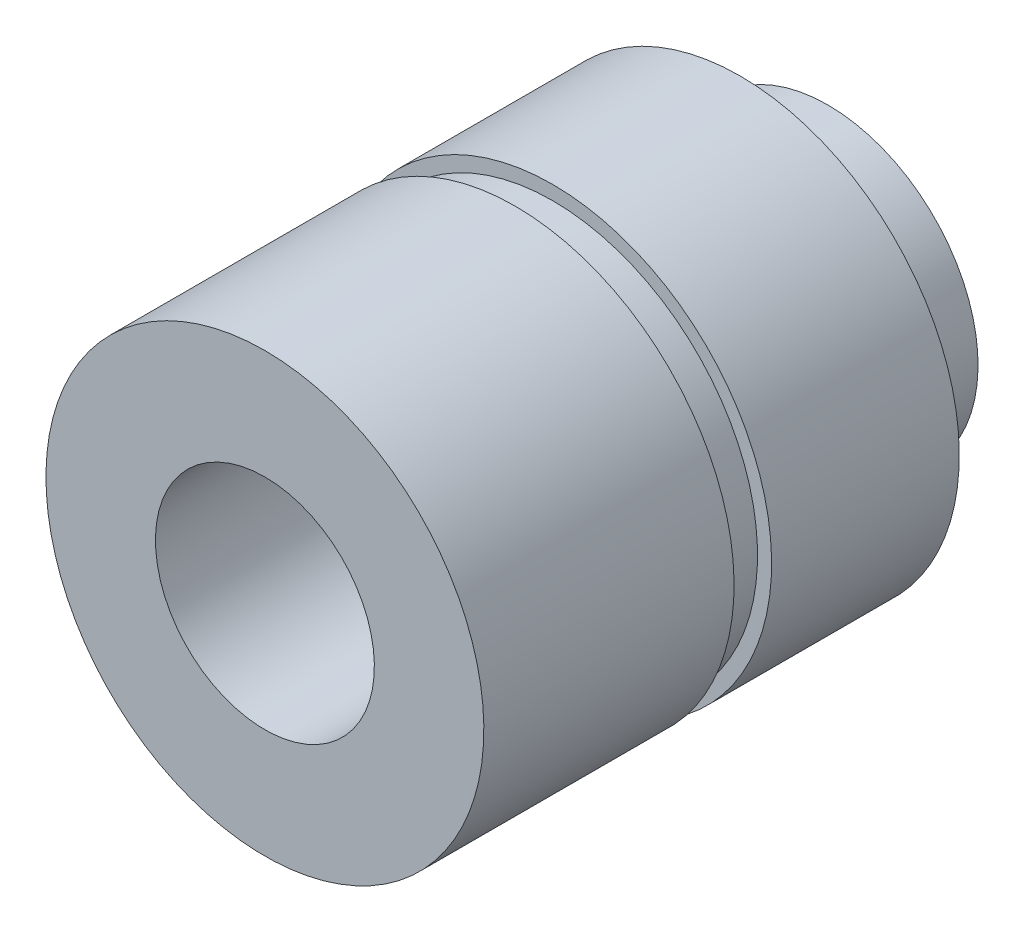
ISO-10303-21;
HEADER;
FILE_DESCRIPTION(('STEP AP214'),'2;1');
FILE_NAME('part.step','',(''),(''),'','','');
FILE_SCHEMA(('AUTOMOTIVE_DESIGN { 1 0 10303 214 1 1 1 1 }'));
ENDSEC;
DATA;
#1=APPLICATION_CONTEXT('core data for automotive mechanical design processes');
#2=APPLICATION_PROTOCOL_DEFINITION('international standard','automotive_design',2000,#1);
#3=PRODUCT_CONTEXT('',#1,'mechanical');
#4=PRODUCT('Part','Part','',(#3));
#5=PRODUCT_RELATED_PRODUCT_CATEGORY('part','',(#4));
#6=PRODUCT_DEFINITION_FORMATION('','',#4);
#7=PRODUCT_DEFINITION_CONTEXT('part definition',#1,'design');
#8=PRODUCT_DEFINITION('design','',#6,#7);
#9=PRODUCT_DEFINITION_SHAPE('','',#8);
#10=(LENGTH_UNIT() NAMED_UNIT(*) SI_UNIT(.MILLI.,.METRE.));
#11=(NAMED_UNIT(*) PLANE_ANGLE_UNIT() SI_UNIT($,.RADIAN.));
#12=(NAMED_UNIT(*) SI_UNIT($,.STERADIAN.) SOLID_ANGLE_UNIT());
#13=UNCERTAINTY_MEASURE_WITH_UNIT(LENGTH_MEASURE(1.E-05),#10,'distance_accuracy_value','');
#14=(GEOMETRIC_REPRESENTATION_CONTEXT(3) GLOBAL_UNCERTAINTY_ASSIGNED_CONTEXT((#13)) GLOBAL_UNIT_ASSIGNED_CONTEXT((#10,
#11,#12)) REPRESENTATION_CONTEXT('',''));
#15=CARTESIAN_POINT('',(0.,0.,0.));
#16=DIRECTION('',(0.,0.,1.));
#17=DIRECTION('',(1.,0.,0.));
#18=AXIS2_PLACEMENT_3D('',#15,#16,#17);
#19=CARTESIAN_POINT('',(0.,0.,-18.));
#20=DIRECTION('',(0.,0.,-1.));
#21=DIRECTION('',(0.,1.,0.));
#22=AXIS2_PLACEMENT_3D('',#19,#20,#21);
#23=CYLINDRICAL_SURFACE('',#22,3.5);
#24=CARTESIAN_POINT('',(0.,0.,-18.));
#25=DIRECTION('',(0.,0.,-1.));
#26=DIRECTION('',(0.,1.,0.));
#27=AXIS2_PLACEMENT_3D('',#24,#25,#26);
#28=CIRCLE('',#27,3.5);
#29=CARTESIAN_POINT('',(0.,3.5,-18.));
#30=VERTEX_POINT('',#29);
#31=EDGE_CURVE('E86',#30,#30,#28,.T.);
#32=ORIENTED_EDGE('',*,*,#31,.T.);
#33=EDGE_LOOP('',(#32));
#34=FACE_BOUND('',#33,.T.);
#35=CARTESIAN_POINT('',(0.,0.,0.));
#36=DIRECTION('',(0.,0.,-1.));
#37=DIRECTION('',(0.,1.,0.));
#38=AXIS2_PLACEMENT_3D('',#35,#36,#37);
#39=CIRCLE('',#38,3.5);
#40=CARTESIAN_POINT('',(0.,3.5,0.));
#41=VERTEX_POINT('',#40);
#42=EDGE_CURVE('E10',#41,#41,#39,.T.);
#43=ORIENTED_EDGE('',*,*,#42,.F.);
#44=EDGE_LOOP('',(#43));
#45=FACE_BOUND('',#44,.T.);
#46=ADVANCED_FACE('F43',(#34,#45),#23,.F.);
#47=CARTESIAN_POINT('',(0.,3.5,0.));
#48=DIRECTION('',(0.,0.,1.));
#49=DIRECTION('',(0.,-1.,0.));
#50=AXIS2_PLACEMENT_3D('',#47,#48,#49);
#51=PLANE('',#50);
#52=ORIENTED_EDGE('',*,*,#42,.T.);
#53=EDGE_LOOP('',(#52));
#54=FACE_BOUND('',#53,.T.);
#55=CARTESIAN_POINT('',(0.,0.,0.));
#56=DIRECTION('',(0.,0.,-1.));
#57=DIRECTION('',(0.,1.,0.));
#58=AXIS2_PLACEMENT_3D('',#55,#56,#57);
#59=CIRCLE('',#58,7.);
#60=CARTESIAN_POINT('',(0.,7.,0.));
#61=VERTEX_POINT('',#60);
#62=EDGE_CURVE('E50',#61,#61,#59,.T.);
#63=ORIENTED_EDGE('',*,*,#62,.F.);
#64=EDGE_LOOP('',(#63));
#65=FACE_BOUND('',#64,.T.);
#66=ADVANCED_FACE('F105',(#54,#65),#51,.T.);
#67=CARTESIAN_POINT('',(0.,0.,-18.));
#68=DIRECTION('',(0.,0.,-1.));
#69=DIRECTION('',(0.,1.,0.));
#70=AXIS2_PLACEMENT_3D('',#67,#68,#69);
#71=CYLINDRICAL_SURFACE('',#70,7.);
#72=ORIENTED_EDGE('',*,*,#62,.T.);
#73=EDGE_LOOP('',(#72));
#74=FACE_BOUND('',#73,.T.);
#75=CARTESIAN_POINT('',(0.,0.,-8.));
#76=DIRECTION('',(0.,0.,-1.));
#77=DIRECTION('',(0.,1.,0.));
#78=AXIS2_PLACEMENT_3D('',#75,#76,#77);
#79=CIRCLE('',#78,7.);
#80=CARTESIAN_POINT('',(0.,7.,-8.));
#81=VERTEX_POINT('',#80);
#82=EDGE_CURVE('E55',#81,#81,#79,.T.);
#83=ORIENTED_EDGE('',*,*,#82,.F.);
#84=EDGE_LOOP('',(#83));
#85=FACE_BOUND('',#84,.T.);
#86=ADVANCED_FACE('F109',(#74,#85),#71,.T.);
#87=CARTESIAN_POINT('',(0.,7.,-8.));
#88=DIRECTION('',(0.,0.,-1.));
#89=DIRECTION('',(0.,1.,0.));
#90=AXIS2_PLACEMENT_3D('',#87,#88,#89);
#91=PLANE('',#90);
#92=ORIENTED_EDGE('',*,*,#82,.T.);
#93=EDGE_LOOP('',(#92));
#94=FACE_BOUND('',#93,.T.);
#95=CARTESIAN_POINT('',(0.,0.,-8.));
#96=DIRECTION('',(0.,0.,-1.));
#97=DIRECTION('',(0.,1.,0.));
#98=AXIS2_PLACEMENT_3D('',#95,#96,#97);
#99=CIRCLE('',#98,6.55);
#100=CARTESIAN_POINT('',(0.,6.55,-8.));
#101=VERTEX_POINT('',#100);
#102=EDGE_CURVE('E60',#101,#101,#99,.T.);
#103=ORIENTED_EDGE('',*,*,#102,.F.);
#104=EDGE_LOOP('',(#103));
#105=FACE_BOUND('',#104,.T.);
#106=ADVANCED_FACE('F113',(#94,#105),#91,.T.);
#107=CARTESIAN_POINT('',(0.,0.,-18.));
#108=DIRECTION('',(0.,0.,-1.));
#109=DIRECTION('',(0.,1.,0.));
#110=AXIS2_PLACEMENT_3D('',#107,#108,#109);
#111=CYLINDRICAL_SURFACE('',#110,6.55);
#112=ORIENTED_EDGE('',*,*,#102,.T.);
#113=EDGE_LOOP('',(#112));
#114=FACE_BOUND('',#113,.T.);
#115=CARTESIAN_POINT('',(0.,0.,-9.2));
#116=DIRECTION('',(0.,0.,-1.));
#117=DIRECTION('',(0.,1.,0.));
#118=AXIS2_PLACEMENT_3D('',#115,#116,#117);
#119=CIRCLE('',#118,6.55);
#120=CARTESIAN_POINT('',(0.,6.55,-9.2));
#121=VERTEX_POINT('',#120);
#122=EDGE_CURVE('E66',#121,#121,#119,.T.);
#123=ORIENTED_EDGE('',*,*,#122,.F.);
#124=EDGE_LOOP('',(#123));
#125=FACE_BOUND('',#124,.T.);
#126=ADVANCED_FACE('F119',(#114,#125),#111,.T.);
#127=CARTESIAN_POINT('',(0.,6.55,-9.2));
#128=DIRECTION('',(0.,0.,1.));
#129=DIRECTION('',(0.,-1.,0.));
#130=AXIS2_PLACEMENT_3D('',#127,#128,#129);
#131=PLANE('',#130);
#132=ORIENTED_EDGE('',*,*,#122,.T.);
#133=EDGE_LOOP('',(#132));
#134=FACE_BOUND('',#133,.T.);
#135=CARTESIAN_POINT('',(0.,0.,-9.2));
#136=DIRECTION('',(0.,0.,-1.));
#137=DIRECTION('',(0.,1.,0.));
#138=AXIS2_PLACEMENT_3D('',#135,#136,#137);
#139=CIRCLE('',#138,7.);
#140=CARTESIAN_POINT('',(0.,7.,-9.2));
#141=VERTEX_POINT('',#140);
#142=EDGE_CURVE('E70',#141,#141,#139,.T.);
#143=ORIENTED_EDGE('',*,*,#142,.F.);
#144=EDGE_LOOP('',(#143));
#145=FACE_BOUND('',#144,.T.);
#146=ADVANCED_FACE('F123',(#134,#145),#131,.T.);
#147=CARTESIAN_POINT('',(0.,0.,-18.));
#148=DIRECTION('',(0.,0.,-1.));
#149=DIRECTION('',(0.,1.,0.));
#150=AXIS2_PLACEMENT_3D('',#147,#148,#149);
#151=CYLINDRICAL_SURFACE('',#150,7.);
#152=ORIENTED_EDGE('',*,*,#142,.T.);
#153=EDGE_LOOP('',(#152));
#154=FACE_BOUND('',#153,.T.);
#155=CARTESIAN_POINT('',(0.,0.,-15.2));
#156=DIRECTION('',(0.,0.,-1.));
#157=DIRECTION('',(0.,1.,0.));
#158=AXIS2_PLACEMENT_3D('',#155,#156,#157);
#159=CIRCLE('',#158,7.);
#160=CARTESIAN_POINT('',(0.,7.,-15.2));
#161=VERTEX_POINT('',#160);
#162=EDGE_CURVE('E74',#161,#161,#159,.T.);
#163=ORIENTED_EDGE('',*,*,#162,.F.);
#164=EDGE_LOOP('',(#163));
#165=FACE_BOUND('',#164,.T.);
#166=ADVANCED_FACE('F127',(#154,#165),#151,.T.);
#167=CARTESIAN_POINT('',(0.,7.,-15.2));
#168=DIRECTION('',(0.,0.,-1.));
#169=DIRECTION('',(0.,1.,0.));
#170=AXIS2_PLACEMENT_3D('',#167,#168,#169);
#171=PLANE('',#170);
#172=ORIENTED_EDGE('',*,*,#162,.T.);
#173=EDGE_LOOP('',(#172));
#174=FACE_BOUND('',#173,.T.);
#175=CARTESIAN_POINT('',(0.,0.,-15.2));
#176=DIRECTION('',(0.,0.,-1.));
#177=DIRECTION('',(0.,1.,0.));
#178=AXIS2_PLACEMENT_3D('',#175,#176,#177);
#179=CIRCLE('',#178,4.8);
#180=CARTESIAN_POINT('',(0.,4.8,-15.2));
#181=VERTEX_POINT('',#180);
#182=EDGE_CURVE('E78',#181,#181,#179,.T.);
#183=ORIENTED_EDGE('',*,*,#182,.F.);
#184=EDGE_LOOP('',(#183));
#185=FACE_BOUND('',#184,.T.);
#186=ADVANCED_FACE('F101',(#174,#185),#171,.T.);
#187=CARTESIAN_POINT('',(0.,0.,-18.));
#188=DIRECTION('',(0.,0.,-1.));
#189=DIRECTION('',(0.,1.,0.));
#190=AXIS2_PLACEMENT_3D('',#187,#188,#189);
#191=CYLINDRICAL_SURFACE('',#190,4.8);
#192=ORIENTED_EDGE('',*,*,#182,.T.);
#193=EDGE_LOOP('',(#192));
#194=FACE_BOUND('',#193,.T.);
#195=CARTESIAN_POINT('',(0.,0.,-18.));
#196=DIRECTION('',(0.,0.,-1.));
#197=DIRECTION('',(0.,1.,0.));
#198=AXIS2_PLACEMENT_3D('',#195,#196,#197);
#199=CIRCLE('',#198,4.8);
#200=CARTESIAN_POINT('',(0.,4.8,-18.));
#201=VERTEX_POINT('',#200);
#202=EDGE_CURVE('E82',#201,#201,#199,.T.);
#203=ORIENTED_EDGE('',*,*,#202,.F.);
#204=EDGE_LOOP('',(#203));
#205=FACE_BOUND('',#204,.T.);
#206=ADVANCED_FACE('F95',(#194,#205),#191,.T.);
#207=CARTESIAN_POINT('',(0.,4.8,-18.));
#208=DIRECTION('',(0.,0.,-1.));
#209=DIRECTION('',(0.,1.,0.));
#210=AXIS2_PLACEMENT_3D('',#207,#208,#209);
#211=PLANE('',#210);
#212=ORIENTED_EDGE('',*,*,#202,.T.);
#213=EDGE_LOOP('',(#212));
#214=FACE_BOUND('',#213,.T.);
#215=ORIENTED_EDGE('',*,*,#31,.F.);
#216=EDGE_LOOP('',(#215));
#217=FACE_BOUND('',#216,.T.);
#218=ADVANCED_FACE('F93',(#214,#217),#211,.T.);
#219=CLOSED_SHELL('',(#46,#66,#86,#106,#126,#146,#166,#186,#206,#218));
#220=MANIFOLD_SOLID_BREP('B2',#219);
#221=ADVANCED_BREP_SHAPE_REPRESENTATION('',(#18,#220),#14);
#222=SHAPE_DEFINITION_REPRESENTATION(#9,#221);
ENDSEC;
END-ISO-10303-21;
